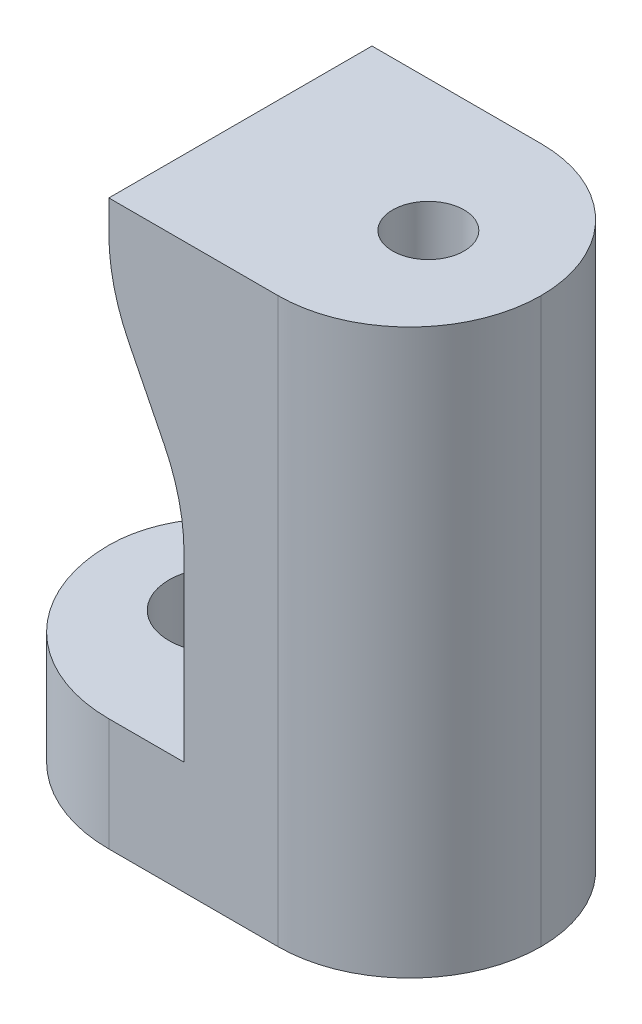
ISO-10303-21;
HEADER;
FILE_DESCRIPTION(('STEP AP214'),'2;1');
FILE_NAME('part.step','',(''),(''),'','','');
FILE_SCHEMA(('AUTOMOTIVE_DESIGN { 1 0 10303 214 1 1 1 1 }'));
ENDSEC;
DATA;
#1=APPLICATION_CONTEXT('core data for automotive mechanical design processes');
#2=APPLICATION_PROTOCOL_DEFINITION('international standard','automotive_design',2000,#1);
#3=PRODUCT_CONTEXT('',#1,'mechanical');
#4=PRODUCT('Part','Part','',(#3));
#5=PRODUCT_RELATED_PRODUCT_CATEGORY('part','',(#4));
#6=PRODUCT_DEFINITION_FORMATION('','',#4);
#7=PRODUCT_DEFINITION_CONTEXT('part definition',#1,'design');
#8=PRODUCT_DEFINITION('design','',#6,#7);
#9=PRODUCT_DEFINITION_SHAPE('','',#8);
#10=(LENGTH_UNIT() NAMED_UNIT(*) SI_UNIT(.MILLI.,.METRE.));
#11=(NAMED_UNIT(*) PLANE_ANGLE_UNIT() SI_UNIT($,.RADIAN.));
#12=(NAMED_UNIT(*) SI_UNIT($,.STERADIAN.) SOLID_ANGLE_UNIT());
#13=UNCERTAINTY_MEASURE_WITH_UNIT(LENGTH_MEASURE(1.E-05),#10,'distance_accuracy_value','');
#14=(GEOMETRIC_REPRESENTATION_CONTEXT(3) GLOBAL_UNCERTAINTY_ASSIGNED_CONTEXT((#13)) GLOBAL_UNIT_ASSIGNED_CONTEXT((#10,
#11,#12)) REPRESENTATION_CONTEXT('',''));
#15=CARTESIAN_POINT('',(0.,0.,0.));
#16=DIRECTION('',(0.,0.,1.));
#17=DIRECTION('',(1.,0.,0.));
#18=AXIS2_PLACEMENT_3D('',#15,#16,#17);
#19=CARTESIAN_POINT('',(6.,15.,7.));
#20=DIRECTION('',(0.,-1.,0.));
#21=DIRECTION('',(1.,0.,0.));
#22=AXIS2_PLACEMENT_3D('',#19,#20,#21);
#23=PLANE('',#22);
#24=CARTESIAN_POINT('',(3.,15.,3.5));
#25=DIRECTION('',(0.,1.,0.));
#26=DIRECTION('',(0.,0.,1.));
#27=AXIS2_PLACEMENT_3D('',#24,#25,#26);
#28=CIRCLE('',#27,0.95);
#29=CARTESIAN_POINT('',(3.,15.,4.45));
#30=VERTEX_POINT('',#29);
#31=EDGE_CURVE('E199',#30,#30,#28,.T.);
#32=ORIENTED_EDGE('',*,*,#31,.F.);
#33=EDGE_LOOP('',(#32));
#34=FACE_BOUND('',#33,.T.);
#35=DIRECTION('',(-1.,0.,0.));
#36=VECTOR('',#35,1.);
#37=CARTESIAN_POINT('',(6.,15.,7.));
#38=LINE('',#37,#36);
#39=CARTESIAN_POINT('',(2.5,15.,7.));
#40=VERTEX_POINT('',#39);
#41=CARTESIAN_POINT('',(-2.,15.,7.));
#42=VERTEX_POINT('',#41);
#43=EDGE_CURVE('E122',#40,#42,#38,.T.);
#44=ORIENTED_EDGE('',*,*,#43,.F.);
#45=CARTESIAN_POINT('',(2.5,15.,3.5));
#46=DIRECTION('',(0.,-1.,0.));
#47=DIRECTION('',(1.,0.,0.));
#48=AXIS2_PLACEMENT_3D('',#45,#46,#47);
#49=CIRCLE('',#48,3.5);
#50=CARTESIAN_POINT('',(6.,15.,3.5));
#51=VERTEX_POINT('',#50);
#52=EDGE_CURVE('E187',#40,#51,#49,.F.);
#53=ORIENTED_EDGE('',*,*,#52,.T.);
#54=CARTESIAN_POINT('',(2.5,15.,3.5));
#55=DIRECTION('',(0.,-1.,0.));
#56=DIRECTION('',(1.,0.,0.));
#57=AXIS2_PLACEMENT_3D('',#54,#55,#56);
#58=CIRCLE('',#57,3.5);
#59=CARTESIAN_POINT('',(2.5,15.,0.));
#60=VERTEX_POINT('',#59);
#61=EDGE_CURVE('E185',#51,#60,#58,.F.);
#62=ORIENTED_EDGE('',*,*,#61,.T.);
#63=DIRECTION('',(-1.,0.,0.));
#64=VECTOR('',#63,1.);
#65=CARTESIAN_POINT('',(6.,15.,0.));
#66=LINE('',#65,#64);
#67=CARTESIAN_POINT('',(-2.,15.,0.));
#68=VERTEX_POINT('',#67);
#69=EDGE_CURVE('E136',#60,#68,#66,.T.);
#70=ORIENTED_EDGE('',*,*,#69,.T.);
#71=DIRECTION('',(0.,0.,-1.));
#72=VECTOR('',#71,1.);
#73=CARTESIAN_POINT('',(-2.,15.,7.));
#74=LINE('',#73,#72);
#75=EDGE_CURVE('E134',#42,#68,#74,.T.);
#76=ORIENTED_EDGE('',*,*,#75,.F.);
#77=EDGE_LOOP('',(#44,#53,#62,#70,#76));
#78=FACE_BOUND('',#77,.T.);
#79=ADVANCED_FACE('F33',(#34,#78),#23,.F.);
#80=CARTESIAN_POINT('',(-2.,15.,7.));
#81=DIRECTION('',(1.,0.,0.));
#82=DIRECTION('',(0.,1.,0.));
#83=AXIS2_PLACEMENT_3D('',#80,#81,#82);
#84=PLANE('',#83);
#85=DIRECTION('',(0.,-1.,0.));
#86=VECTOR('',#85,1.);
#87=CARTESIAN_POINT('',(-2.,15.,0.));
#88=LINE('',#87,#86);
#89=CARTESIAN_POINT('',(-2.,14.1803398874989,0.));
#90=VERTEX_POINT('',#89);
#91=EDGE_CURVE('E153',#68,#90,#88,.T.);
#92=ORIENTED_EDGE('',*,*,#91,.T.);
#93=DIRECTION('',(0.,0.,-1.));
#94=VECTOR('',#93,1.);
#95=CARTESIAN_POINT('',(-2.,14.1803398874989,7.));
#96=LINE('',#95,#94);
#97=CARTESIAN_POINT('',(-2.,14.1803398874989,7.));
#98=VERTEX_POINT('',#97);
#99=EDGE_CURVE('E54',#90,#98,#96,.F.);
#100=ORIENTED_EDGE('',*,*,#99,.T.);
#101=DIRECTION('',(0.,-1.,0.));
#102=VECTOR('',#101,1.);
#103=CARTESIAN_POINT('',(-2.,15.,7.));
#104=LINE('',#103,#102);
#105=EDGE_CURVE('E125',#42,#98,#104,.T.);
#106=ORIENTED_EDGE('',*,*,#105,.F.);
#107=ORIENTED_EDGE('',*,*,#75,.T.);
#108=EDGE_LOOP('',(#92,#100,#106,#107));
#109=FACE_BOUND('',#108,.T.);
#110=ADVANCED_FACE('F141',(#109),#84,.F.);
#111=CARTESIAN_POINT('',(-2.,13.,7.));
#112=DIRECTION('',(0.894427190999916,0.447213595499958,0.));
#113=DIRECTION('',(-0.447213595499958,0.894427190999916,0.));
#114=AXIS2_PLACEMENT_3D('',#111,#112,#113);
#115=PLANE('',#114);
#116=DIRECTION('',(0.447213595499958,-0.894427190999916,0.));
#117=VECTOR('',#116,1.);
#118=CARTESIAN_POINT('',(-2.,13.,7.));
#119=LINE('',#118,#117);
#120=CARTESIAN_POINT('',(-1.47213595499958,11.9442719099992,7.));
#121=VERTEX_POINT('',#120);
#122=CARTESIAN_POINT('',(-0.527864045000419,10.0557280900008,7.));
#123=VERTEX_POINT('',#122);
#124=EDGE_CURVE('E142',#121,#123,#119,.T.);
#125=ORIENTED_EDGE('',*,*,#124,.F.);
#126=DIRECTION('',(0.,0.,-1.));
#127=VECTOR('',#126,1.);
#128=CARTESIAN_POINT('',(-1.47213595499958,11.9442719099992,7.));
#129=LINE('',#128,#127);
#130=CARTESIAN_POINT('',(-1.47213595499958,11.9442719099992,0.));
#131=VERTEX_POINT('',#130);
#132=EDGE_CURVE('E201',#121,#131,#129,.T.);
#133=ORIENTED_EDGE('',*,*,#132,.T.);
#134=DIRECTION('',(0.447213595499958,-0.894427190999916,0.));
#135=VECTOR('',#134,1.);
#136=CARTESIAN_POINT('',(-2.,13.,0.));
#137=LINE('',#136,#135);
#138=CARTESIAN_POINT('',(-0.527864045000419,10.0557280900008,0.));
#139=VERTEX_POINT('',#138);
#140=EDGE_CURVE('E156',#131,#139,#137,.T.);
#141=ORIENTED_EDGE('',*,*,#140,.T.);
#142=DIRECTION('',(0.,0.,-1.));
#143=VECTOR('',#142,1.);
#144=CARTESIAN_POINT('',(-0.527864045000419,10.0557280900008,7.));
#145=LINE('',#144,#143);
#146=EDGE_CURVE('E195',#139,#123,#145,.F.);
#147=ORIENTED_EDGE('',*,*,#146,.T.);
#148=EDGE_LOOP('',(#125,#133,#141,#147));
#149=FACE_BOUND('',#148,.T.);
#150=ADVANCED_FACE('F221',(#149),#115,.F.);
#151=CARTESIAN_POINT('',(0.,3.,7.));
#152=DIRECTION('',(1.,0.,0.));
#153=DIRECTION('',(0.,1.,0.));
#154=AXIS2_PLACEMENT_3D('',#151,#152,#153);
#155=PLANE('',#154);
#156=DIRECTION('',(0.,-1.,0.));
#157=VECTOR('',#156,1.);
#158=CARTESIAN_POINT('',(0.,3.,7.));
#159=LINE('',#158,#157);
#160=CARTESIAN_POINT('',(0.,7.81966011250105,7.));
#161=VERTEX_POINT('',#160);
#162=CARTESIAN_POINT('',(0.,3.,7.));
#163=VERTEX_POINT('',#162);
#164=EDGE_CURVE('E144',#161,#163,#159,.T.);
#165=ORIENTED_EDGE('',*,*,#164,.F.);
#166=DIRECTION('',(0.,0.,-1.));
#167=VECTOR('',#166,1.);
#168=CARTESIAN_POINT('',(0.,7.81966011250105,0.));
#169=LINE('',#168,#167);
#170=CARTESIAN_POINT('',(0.,7.81966011250105,0.));
#171=VERTEX_POINT('',#170);
#172=EDGE_CURVE('E209',#161,#171,#169,.T.);
#173=ORIENTED_EDGE('',*,*,#172,.T.);
#174=DIRECTION('',(0.,-1.,0.));
#175=VECTOR('',#174,1.);
#176=CARTESIAN_POINT('',(0.,3.,0.));
#177=LINE('',#176,#175);
#178=CARTESIAN_POINT('',(0.,3.,0.));
#179=VERTEX_POINT('',#178);
#180=EDGE_CURVE('E159',#171,#179,#177,.T.);
#181=ORIENTED_EDGE('',*,*,#180,.T.);
#182=DIRECTION('',(0.,0.,-1.));
#183=VECTOR('',#182,1.);
#184=CARTESIAN_POINT('',(0.,3.,7.));
#185=LINE('',#184,#183);
#186=EDGE_CURVE('E139',#163,#179,#185,.T.);
#187=ORIENTED_EDGE('',*,*,#186,.F.);
#188=EDGE_LOOP('',(#165,#173,#181,#187));
#189=FACE_BOUND('',#188,.T.);
#190=ADVANCED_FACE('F224',(#189),#155,.F.);
#191=CARTESIAN_POINT('',(0.,3.,7.));
#192=DIRECTION('',(0.,-1.,0.));
#193=DIRECTION('',(1.,0.,0.));
#194=AXIS2_PLACEMENT_3D('',#191,#192,#193);
#195=PLANE('',#194);
#196=CARTESIAN_POINT('',(-3.,3.,3.));
#197=DIRECTION('',(0.,1.,0.));
#198=DIRECTION('',(-1.,0.,0.));
#199=AXIS2_PLACEMENT_3D('',#196,#197,#198);
#200=CIRCLE('',#199,1.4);
#201=CARTESIAN_POINT('',(-4.4,3.,3.));
#202=VERTEX_POINT('',#201);
#203=EDGE_CURVE('E288',#202,#202,#200,.T.);
#204=ORIENTED_EDGE('',*,*,#203,.F.);
#205=EDGE_LOOP('',(#204));
#206=FACE_BOUND('',#205,.T.);
#207=CARTESIAN_POINT('',(-3.,3.,3.));
#208=DIRECTION('',(0.,-1.,0.));
#209=DIRECTION('',(1.,0.,0.));
#210=AXIS2_PLACEMENT_3D('',#207,#208,#209);
#211=CIRCLE('',#210,3.);
#212=CARTESIAN_POINT('',(-3.,3.,0.));
#213=VERTEX_POINT('',#212);
#214=CARTESIAN_POINT('',(-6.,3.,3.));
#215=VERTEX_POINT('',#214);
#216=EDGE_CURVE('E175',#213,#215,#211,.F.);
#217=ORIENTED_EDGE('',*,*,#216,.T.);
#218=CARTESIAN_POINT('',(-2.,3.,3.));
#219=DIRECTION('',(0.,-1.,0.));
#220=DIRECTION('',(1.,0.,0.));
#221=AXIS2_PLACEMENT_3D('',#218,#219,#220);
#222=CIRCLE('',#221,4.);
#223=CARTESIAN_POINT('',(-2.,3.,7.));
#224=VERTEX_POINT('',#223);
#225=EDGE_CURVE('E182',#215,#224,#222,.F.);
#226=ORIENTED_EDGE('',*,*,#225,.T.);
#227=DIRECTION('',(-1.,0.,0.));
#228=VECTOR('',#227,1.);
#229=CARTESIAN_POINT('',(0.,3.,7.));
#230=LINE('',#229,#228);
#231=EDGE_CURVE('E149',#163,#224,#230,.T.);
#232=ORIENTED_EDGE('',*,*,#231,.F.);
#233=ORIENTED_EDGE('',*,*,#186,.T.);
#234=DIRECTION('',(-1.,0.,0.));
#235=VECTOR('',#234,1.);
#236=CARTESIAN_POINT('',(0.,3.,0.));
#237=LINE('',#236,#235);
#238=EDGE_CURVE('E161',#179,#213,#237,.T.);
#239=ORIENTED_EDGE('',*,*,#238,.T.);
#240=EDGE_LOOP('',(#217,#226,#232,#233,#239));
#241=FACE_BOUND('',#240,.T.);
#242=ADVANCED_FACE('F242',(#206,#241),#195,.F.);
#243=CARTESIAN_POINT('',(0.,0.,7.));
#244=DIRECTION('',(0.,1.,0.));
#245=DIRECTION('',(0.,0.,1.));
#246=AXIS2_PLACEMENT_3D('',#243,#244,#245);
#247=PLANE('',#246);
#248=CARTESIAN_POINT('',(-3.,0.,3.));
#249=DIRECTION('',(0.,1.,0.));
#250=DIRECTION('',(-1.,0.,0.));
#251=AXIS2_PLACEMENT_3D('',#248,#249,#250);
#252=CIRCLE('',#251,1.4);
#253=CARTESIAN_POINT('',(-4.4,0.,3.));
#254=VERTEX_POINT('',#253);
#255=EDGE_CURVE('E154',#254,#254,#252,.T.);
#256=ORIENTED_EDGE('',*,*,#255,.T.);
#257=EDGE_LOOP('',(#256));
#258=FACE_BOUND('',#257,.T.);
#259=CARTESIAN_POINT('',(2.5,0.,3.5));
#260=DIRECTION('',(0.,1.,0.));
#261=DIRECTION('',(0.,0.,1.));
#262=AXIS2_PLACEMENT_3D('',#259,#260,#261);
#263=CIRCLE('',#262,3.5);
#264=CARTESIAN_POINT('',(2.5,0.,0.));
#265=VERTEX_POINT('',#264);
#266=CARTESIAN_POINT('',(6.,0.,3.5));
#267=VERTEX_POINT('',#266);
#268=EDGE_CURVE('E189',#265,#267,#263,.F.);
#269=ORIENTED_EDGE('',*,*,#268,.T.);
#270=CARTESIAN_POINT('',(2.5,0.,3.5));
#271=DIRECTION('',(0.,1.,0.));
#272=DIRECTION('',(0.,0.,1.));
#273=AXIS2_PLACEMENT_3D('',#270,#271,#272);
#274=CIRCLE('',#273,3.5);
#275=CARTESIAN_POINT('',(2.5,0.,7.));
#276=VERTEX_POINT('',#275);
#277=EDGE_CURVE('E191',#267,#276,#274,.F.);
#278=ORIENTED_EDGE('',*,*,#277,.T.);
#279=DIRECTION('',(1.,0.,0.));
#280=VECTOR('',#279,1.);
#281=CARTESIAN_POINT('',(0.,0.,7.));
#282=LINE('',#281,#280);
#283=CARTESIAN_POINT('',(-2.,0.,7.));
#284=VERTEX_POINT('',#283);
#285=EDGE_CURVE('E131',#284,#276,#282,.T.);
#286=ORIENTED_EDGE('',*,*,#285,.F.);
#287=CARTESIAN_POINT('',(-2.,0.,3.));
#288=DIRECTION('',(0.,1.,0.));
#289=DIRECTION('',(0.,0.,1.));
#290=AXIS2_PLACEMENT_3D('',#287,#288,#289);
#291=CIRCLE('',#290,4.);
#292=CARTESIAN_POINT('',(-6.,0.,3.));
#293=VERTEX_POINT('',#292);
#294=EDGE_CURVE('E180',#284,#293,#291,.F.);
#295=ORIENTED_EDGE('',*,*,#294,.T.);
#296=CARTESIAN_POINT('',(-3.,0.,3.));
#297=DIRECTION('',(0.,1.,0.));
#298=DIRECTION('',(0.,0.,1.));
#299=AXIS2_PLACEMENT_3D('',#296,#297,#298);
#300=CIRCLE('',#299,3.);
#301=CARTESIAN_POINT('',(-3.,0.,0.));
#302=VERTEX_POINT('',#301);
#303=EDGE_CURVE('E171',#293,#302,#300,.F.);
#304=ORIENTED_EDGE('',*,*,#303,.T.);
#305=DIRECTION('',(1.,0.,0.));
#306=VECTOR('',#305,1.);
#307=CARTESIAN_POINT('',(0.,0.,0.));
#308=LINE('',#307,#306);
#309=EDGE_CURVE('E164',#302,#265,#308,.T.);
#310=ORIENTED_EDGE('',*,*,#309,.T.);
#311=EDGE_LOOP('',(#269,#278,#286,#295,#304,#310));
#312=FACE_BOUND('',#311,.T.);
#313=ADVANCED_FACE('F236',(#258,#312),#247,.F.);
#314=CARTESIAN_POINT('',(0.,0.,7.));
#315=DIRECTION('',(0.,0.,1.));
#316=DIRECTION('',(1.,0.,0.));
#317=AXIS2_PLACEMENT_3D('',#314,#315,#316);
#318=PLANE('',#317);
#319=ORIENTED_EDGE('',*,*,#105,.T.);
#320=CARTESIAN_POINT('',(3.,14.1803398874989,7.));
#321=DIRECTION('',(0.,0.,1.));
#322=DIRECTION('',(1.,0.,0.));
#323=AXIS2_PLACEMENT_3D('',#320,#321,#322);
#324=CIRCLE('',#323,5.);
#325=EDGE_CURVE('E207',#98,#121,#324,.T.);
#326=ORIENTED_EDGE('',*,*,#325,.T.);
#327=ORIENTED_EDGE('',*,*,#124,.T.);
#328=CARTESIAN_POINT('',(-5.,7.81966011250105,7.));
#329=DIRECTION('',(0.,0.,1.));
#330=DIRECTION('',(1.,0.,0.));
#331=AXIS2_PLACEMENT_3D('',#328,#329,#330);
#332=CIRCLE('',#331,5.);
#333=EDGE_CURVE('E11',#123,#161,#332,.F.);
#334=ORIENTED_EDGE('',*,*,#333,.T.);
#335=ORIENTED_EDGE('',*,*,#164,.T.);
#336=ORIENTED_EDGE('',*,*,#231,.T.);
#337=DIRECTION('',(0.,-1.,0.));
#338=VECTOR('',#337,1.);
#339=CARTESIAN_POINT('',(-2.,0.,7.));
#340=LINE('',#339,#338);
#341=EDGE_CURVE('E177',#224,#284,#340,.T.);
#342=ORIENTED_EDGE('',*,*,#341,.T.);
#343=ORIENTED_EDGE('',*,*,#285,.T.);
#344=DIRECTION('',(0.,1.,0.));
#345=VECTOR('',#344,1.);
#346=CARTESIAN_POINT('',(2.5,15.,7.));
#347=LINE('',#346,#345);
#348=EDGE_CURVE('E129',#276,#40,#347,.T.);
#349=ORIENTED_EDGE('',*,*,#348,.T.);
#350=ORIENTED_EDGE('',*,*,#43,.T.);
#351=EDGE_LOOP('',(#319,#326,#327,#334,#335,#336,#342,#343,#349,#350));
#352=FACE_BOUND('',#351,.T.);
#353=ADVANCED_FACE('F124',(#352),#318,.T.);
#354=CARTESIAN_POINT('',(0.,0.,0.));
#355=DIRECTION('',(0.,0.,1.));
#356=DIRECTION('',(1.,0.,0.));
#357=AXIS2_PLACEMENT_3D('',#354,#355,#356);
#358=PLANE('',#357);
#359=ORIENTED_EDGE('',*,*,#140,.F.);
#360=CARTESIAN_POINT('',(3.,14.1803398874989,0.));
#361=DIRECTION('',(0.,0.,1.));
#362=DIRECTION('',(1.,0.,0.));
#363=AXIS2_PLACEMENT_3D('',#360,#361,#362);
#364=CIRCLE('',#363,5.);
#365=EDGE_CURVE('E204',#131,#90,#364,.F.);
#366=ORIENTED_EDGE('',*,*,#365,.T.);
#367=ORIENTED_EDGE('',*,*,#91,.F.);
#368=ORIENTED_EDGE('',*,*,#69,.F.);
#369=DIRECTION('',(0.,1.,0.));
#370=VECTOR('',#369,1.);
#371=CARTESIAN_POINT('',(2.5,0.,0.));
#372=LINE('',#371,#370);
#373=EDGE_CURVE('E193',#60,#265,#372,.F.);
#374=ORIENTED_EDGE('',*,*,#373,.T.);
#375=ORIENTED_EDGE('',*,*,#309,.F.);
#376=DIRECTION('',(0.,-1.,0.));
#377=VECTOR('',#376,1.);
#378=CARTESIAN_POINT('',(-3.,0.,0.));
#379=LINE('',#378,#377);
#380=EDGE_CURVE('E173',#302,#213,#379,.F.);
#381=ORIENTED_EDGE('',*,*,#380,.T.);
#382=ORIENTED_EDGE('',*,*,#238,.F.);
#383=ORIENTED_EDGE('',*,*,#180,.F.);
#384=CARTESIAN_POINT('',(-5.,7.81966011250105,0.));
#385=DIRECTION('',(0.,0.,1.));
#386=DIRECTION('',(1.,0.,0.));
#387=AXIS2_PLACEMENT_3D('',#384,#385,#386);
#388=CIRCLE('',#387,5.);
#389=EDGE_CURVE('E41',#171,#139,#388,.T.);
#390=ORIENTED_EDGE('',*,*,#389,.T.);
#391=EDGE_LOOP('',(#359,#366,#367,#368,#374,#375,#381,#382,#383,#390));
#392=FACE_BOUND('',#391,.T.);
#393=ADVANCED_FACE('F214',(#392),#358,.F.);
#394=CARTESIAN_POINT('',(-3.,0.,3.));
#395=DIRECTION('',(0.,1.,0.));
#396=DIRECTION('',(-1.,0.,0.));
#397=AXIS2_PLACEMENT_3D('',#394,#395,#396);
#398=CYLINDRICAL_SURFACE('',#397,1.4);
#399=ORIENTED_EDGE('',*,*,#255,.F.);
#400=EDGE_LOOP('',(#399));
#401=FACE_BOUND('',#400,.T.);
#402=ORIENTED_EDGE('',*,*,#203,.T.);
#403=EDGE_LOOP('',(#402));
#404=FACE_BOUND('',#403,.T.);
#405=ADVANCED_FACE('F303',(#401,#404),#398,.F.);
#406=CARTESIAN_POINT('',(3.,5.,3.5));
#407=DIRECTION('',(0.,1.,0.));
#408=DIRECTION('',(0.,0.,1.));
#409=AXIS2_PLACEMENT_3D('',#406,#407,#408);
#410=CYLINDRICAL_SURFACE('',#409,0.95);
#411=CARTESIAN_POINT('',(3.,5.,3.5));
#412=DIRECTION('',(0.,1.,0.));
#413=DIRECTION('',(0.,0.,1.));
#414=AXIS2_PLACEMENT_3D('',#411,#412,#413);
#415=CIRCLE('',#414,0.95);
#416=CARTESIAN_POINT('',(3.,5.,4.45));
#417=VERTEX_POINT('',#416);
#418=EDGE_CURVE('E291',#417,#417,#415,.T.);
#419=ORIENTED_EDGE('',*,*,#418,.F.);
#420=EDGE_LOOP('',(#419));
#421=FACE_BOUND('',#420,.T.);
#422=ORIENTED_EDGE('',*,*,#31,.T.);
#423=EDGE_LOOP('',(#422));
#424=FACE_BOUND('',#423,.T.);
#425=ADVANCED_FACE('F300',(#421,#424),#410,.F.);
#426=CARTESIAN_POINT('',(3.,5.,3.5));
#427=DIRECTION('',(0.,1.,0.));
#428=DIRECTION('',(0.,0.,1.));
#429=AXIS2_PLACEMENT_3D('',#426,#427,#428);
#430=PLANE('',#429);
#431=ORIENTED_EDGE('',*,*,#418,.T.);
#432=EDGE_LOOP('',(#431));
#433=FACE_BOUND('',#432,.T.);
#434=ADVANCED_FACE('F266',(#433),#430,.T.);
#435=CARTESIAN_POINT('',(-3.,0.,3.));
#436=DIRECTION('',(0.,-1.,0.));
#437=DIRECTION('',(0.,0.,-1.));
#438=AXIS2_PLACEMENT_3D('',#435,#436,#437);
#439=CYLINDRICAL_SURFACE('',#438,3.);
#440=ORIENTED_EDGE('',*,*,#216,.F.);
#441=ORIENTED_EDGE('',*,*,#380,.F.);
#442=ORIENTED_EDGE('',*,*,#303,.F.);
#443=DIRECTION('',(0.,-1.,0.));
#444=VECTOR('',#443,1.);
#445=CARTESIAN_POINT('',(-6.,0.,3.));
#446=LINE('',#445,#444);
#447=EDGE_CURVE('E138',#215,#293,#446,.T.);
#448=ORIENTED_EDGE('',*,*,#447,.F.);
#449=EDGE_LOOP('',(#440,#441,#442,#448));
#450=FACE_BOUND('',#449,.T.);
#451=ADVANCED_FACE('F241',(#450),#439,.T.);
#452=CARTESIAN_POINT('',(-2.,0.,3.));
#453=DIRECTION('',(0.,1.,0.));
#454=DIRECTION('',(0.,0.,1.));
#455=AXIS2_PLACEMENT_3D('',#452,#453,#454);
#456=CYLINDRICAL_SURFACE('',#455,4.);
#457=ORIENTED_EDGE('',*,*,#225,.F.);
#458=ORIENTED_EDGE('',*,*,#447,.T.);
#459=ORIENTED_EDGE('',*,*,#294,.F.);
#460=ORIENTED_EDGE('',*,*,#341,.F.);
#461=EDGE_LOOP('',(#457,#458,#459,#460));
#462=FACE_BOUND('',#461,.T.);
#463=ADVANCED_FACE('F232',(#462),#456,.T.);
#464=CARTESIAN_POINT('',(2.5,0.,3.5));
#465=DIRECTION('',(0.,1.,0.));
#466=DIRECTION('',(0.,0.,1.));
#467=AXIS2_PLACEMENT_3D('',#464,#465,#466);
#468=CYLINDRICAL_SURFACE('',#467,3.5);
#469=DIRECTION('',(0.,1.,0.));
#470=VECTOR('',#469,1.);
#471=CARTESIAN_POINT('',(6.,0.,3.5));
#472=LINE('',#471,#470);
#473=EDGE_CURVE('E196',#267,#51,#472,.T.);
#474=ORIENTED_EDGE('',*,*,#473,.F.);
#475=ORIENTED_EDGE('',*,*,#268,.F.);
#476=ORIENTED_EDGE('',*,*,#373,.F.);
#477=ORIENTED_EDGE('',*,*,#61,.F.);
#478=EDGE_LOOP('',(#474,#475,#476,#477));
#479=FACE_BOUND('',#478,.T.);
#480=ADVANCED_FACE('F269',(#479),#468,.T.);
#481=CARTESIAN_POINT('',(2.5,0.,3.5));
#482=DIRECTION('',(0.,-1.,0.));
#483=DIRECTION('',(0.,0.,-1.));
#484=AXIS2_PLACEMENT_3D('',#481,#482,#483);
#485=CYLINDRICAL_SURFACE('',#484,3.5);
#486=ORIENTED_EDGE('',*,*,#277,.F.);
#487=ORIENTED_EDGE('',*,*,#473,.T.);
#488=ORIENTED_EDGE('',*,*,#52,.F.);
#489=ORIENTED_EDGE('',*,*,#348,.F.);
#490=EDGE_LOOP('',(#486,#487,#488,#489));
#491=FACE_BOUND('',#490,.T.);
#492=ADVANCED_FACE('F270',(#491),#485,.T.);
#493=CARTESIAN_POINT('',(3.,14.1803398874989,7.));
#494=DIRECTION('',(0.,0.,-1.));
#495=DIRECTION('',(-1.,0.,0.));
#496=AXIS2_PLACEMENT_3D('',#493,#494,#495);
#497=CYLINDRICAL_SURFACE('',#496,5.);
#498=ORIENTED_EDGE('',*,*,#325,.F.);
#499=ORIENTED_EDGE('',*,*,#99,.F.);
#500=ORIENTED_EDGE('',*,*,#365,.F.);
#501=ORIENTED_EDGE('',*,*,#132,.F.);
#502=EDGE_LOOP('',(#498,#499,#500,#501));
#503=FACE_BOUND('',#502,.T.);
#504=ADVANCED_FACE('F273',(#503),#497,.T.);
#505=CARTESIAN_POINT('',(-5.,7.81966011250105,7.));
#506=DIRECTION('',(0.,0.,1.));
#507=DIRECTION('',(1.,0.,0.));
#508=AXIS2_PLACEMENT_3D('',#505,#506,#507);
#509=CYLINDRICAL_SURFACE('',#508,5.);
#510=ORIENTED_EDGE('',*,*,#333,.F.);
#511=ORIENTED_EDGE('',*,*,#146,.F.);
#512=ORIENTED_EDGE('',*,*,#389,.F.);
#513=ORIENTED_EDGE('',*,*,#172,.F.);
#514=EDGE_LOOP('',(#510,#511,#512,#513));
#515=FACE_BOUND('',#514,.T.);
#516=ADVANCED_FACE('F35',(#515),#509,.F.);
#517=CLOSED_SHELL('',(#79,#110,#150,#190,#242,#313,#353,#393,#405,#425,#434,#451,#463,#480,#492,
#504,#516));
#518=MANIFOLD_SOLID_BREP('B2',#517);
#519=ADVANCED_BREP_SHAPE_REPRESENTATION('',(#18,#518),#14);
#520=SHAPE_DEFINITION_REPRESENTATION(#9,#519);
ENDSEC;
END-ISO-10303-21;
